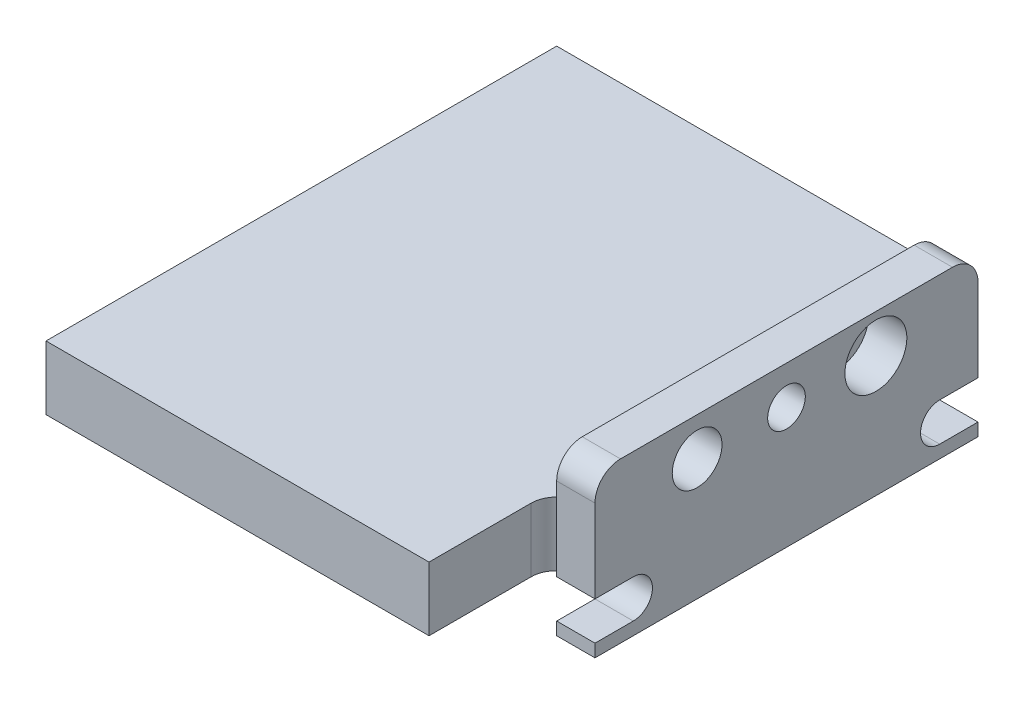
ISO-10303-21;
HEADER;
FILE_DESCRIPTION(('STEP AP214'),'2;1');
FILE_NAME('part.step','',(''),(''),'','','');
FILE_SCHEMA(('AUTOMOTIVE_DESIGN { 1 0 10303 214 1 1 1 1 }'));
ENDSEC;
DATA;
#1=APPLICATION_CONTEXT('core data for automotive mechanical design processes');
#2=APPLICATION_PROTOCOL_DEFINITION('international standard','automotive_design',2000,#1);
#3=PRODUCT_CONTEXT('',#1,'mechanical');
#4=PRODUCT('Part','Part','',(#3));
#5=PRODUCT_RELATED_PRODUCT_CATEGORY('part','',(#4));
#6=PRODUCT_DEFINITION_FORMATION('','',#4);
#7=PRODUCT_DEFINITION_CONTEXT('part definition',#1,'design');
#8=PRODUCT_DEFINITION('design','',#6,#7);
#9=PRODUCT_DEFINITION_SHAPE('','',#8);
#10=(LENGTH_UNIT() NAMED_UNIT(*) SI_UNIT(.MILLI.,.METRE.));
#11=(NAMED_UNIT(*) PLANE_ANGLE_UNIT() SI_UNIT($,.RADIAN.));
#12=(NAMED_UNIT(*) SI_UNIT($,.STERADIAN.) SOLID_ANGLE_UNIT());
#13=UNCERTAINTY_MEASURE_WITH_UNIT(LENGTH_MEASURE(1.E-05),#10,'distance_accuracy_value','');
#14=(GEOMETRIC_REPRESENTATION_CONTEXT(3) GLOBAL_UNCERTAINTY_ASSIGNED_CONTEXT((#13)) GLOBAL_UNIT_ASSIGNED_CONTEXT((#10,
#11,#12)) REPRESENTATION_CONTEXT('',''));
#15=CARTESIAN_POINT('',(0.,0.,0.));
#16=DIRECTION('',(0.,0.,1.));
#17=DIRECTION('',(1.,0.,0.));
#18=AXIS2_PLACEMENT_3D('',#15,#16,#17);
#19=CARTESIAN_POINT('',(3.,0.,0.));
#20=DIRECTION('',(1.,0.,0.));
#21=DIRECTION('',(0.,0.,-1.));
#22=AXIS2_PLACEMENT_3D('',#19,#20,#21);
#23=PLANE('',#22);
#24=DIRECTION('',(0.,0.,-1.));
#25=VECTOR('',#24,1.);
#26=CARTESIAN_POINT('',(3.,-2.5,15.));
#27=LINE('',#26,#25);
#28=CARTESIAN_POINT('',(3.,-2.5,15.));
#29=VERTEX_POINT('',#28);
#30=CARTESIAN_POINT('',(3.,-2.5,-15.));
#31=VERTEX_POINT('',#30);
#32=EDGE_CURVE('E202',#29,#31,#27,.T.);
#33=ORIENTED_EDGE('',*,*,#32,.T.);
#34=DIRECTION('',(0.,1.,0.));
#35=VECTOR('',#34,1.);
#36=CARTESIAN_POINT('',(3.,10.,-15.));
#37=LINE('',#36,#35);
#38=CARTESIAN_POINT('',(3.,-1.5,-15.));
#39=VERTEX_POINT('',#38);
#40=EDGE_CURVE('E335',#31,#39,#37,.T.);
#41=ORIENTED_EDGE('',*,*,#40,.T.);
#42=DIRECTION('',(0.,0.,-1.));
#43=VECTOR('',#42,1.);
#44=CARTESIAN_POINT('',(3.,-1.5,-12.));
#45=LINE('',#44,#43);
#46=CARTESIAN_POINT('',(3.,-1.5,-12.));
#47=VERTEX_POINT('',#46);
#48=EDGE_CURVE('E367',#47,#39,#45,.T.);
#49=ORIENTED_EDGE('',*,*,#48,.F.);
#50=CARTESIAN_POINT('',(3.,0.,-12.));
#51=DIRECTION('',(1.,0.,0.));
#52=DIRECTION('',(0.,0.,1.));
#53=AXIS2_PLACEMENT_3D('',#50,#51,#52);
#54=CIRCLE('',#53,1.5);
#55=CARTESIAN_POINT('',(3.,1.5,-12.));
#56=VERTEX_POINT('',#55);
#57=EDGE_CURVE('E364',#56,#47,#54,.T.);
#58=ORIENTED_EDGE('',*,*,#57,.F.);
#59=DIRECTION('',(0.,0.,1.));
#60=VECTOR('',#59,1.);
#61=CARTESIAN_POINT('',(3.,1.5,-12.));
#62=LINE('',#61,#60);
#63=CARTESIAN_POINT('',(3.,1.5,-15.));
#64=VERTEX_POINT('',#63);
#65=EDGE_CURVE('E362',#64,#56,#62,.T.);
#66=ORIENTED_EDGE('',*,*,#65,.F.);
#67=CARTESIAN_POINT('',(3.,8.,-15.));
#68=VERTEX_POINT('',#67);
#69=EDGE_CURVE('E228',#64,#68,#37,.T.);
#70=ORIENTED_EDGE('',*,*,#69,.T.);
#71=CARTESIAN_POINT('',(3.,8.,-13.));
#72=DIRECTION('',(1.,0.,0.));
#73=DIRECTION('',(0.,0.,-1.));
#74=AXIS2_PLACEMENT_3D('',#71,#72,#73);
#75=CIRCLE('',#74,2.);
#76=CARTESIAN_POINT('',(3.,10.,-13.));
#77=VERTEX_POINT('',#76);
#78=EDGE_CURVE('E263',#68,#77,#75,.T.);
#79=ORIENTED_EDGE('',*,*,#78,.T.);
#80=DIRECTION('',(0.,0.,1.));
#81=VECTOR('',#80,1.);
#82=CARTESIAN_POINT('',(3.,10.,15.));
#83=LINE('',#82,#81);
#84=CARTESIAN_POINT('',(3.,10.,13.));
#85=VERTEX_POINT('',#84);
#86=EDGE_CURVE('E337',#77,#85,#83,.T.);
#87=ORIENTED_EDGE('',*,*,#86,.T.);
#88=CARTESIAN_POINT('',(3.,8.,13.));
#89=DIRECTION('',(1.,0.,0.));
#90=DIRECTION('',(0.,0.,-1.));
#91=AXIS2_PLACEMENT_3D('',#88,#89,#90);
#92=CIRCLE('',#91,2.);
#93=CARTESIAN_POINT('',(3.,8.,15.));
#94=VERTEX_POINT('',#93);
#95=EDGE_CURVE('E271',#85,#94,#92,.T.);
#96=ORIENTED_EDGE('',*,*,#95,.T.);
#97=DIRECTION('',(0.,-1.,0.));
#98=VECTOR('',#97,1.);
#99=CARTESIAN_POINT('',(3.,10.,15.));
#100=LINE('',#99,#98);
#101=CARTESIAN_POINT('',(3.,1.5,15.));
#102=VERTEX_POINT('',#101);
#103=EDGE_CURVE('E243',#94,#102,#100,.T.);
#104=ORIENTED_EDGE('',*,*,#103,.T.);
#105=DIRECTION('',(0.,0.,1.));
#106=VECTOR('',#105,1.);
#107=CARTESIAN_POINT('',(3.,1.5,12.));
#108=LINE('',#107,#106);
#109=CARTESIAN_POINT('',(3.,1.5,12.));
#110=VERTEX_POINT('',#109);
#111=EDGE_CURVE('E394',#110,#102,#108,.T.);
#112=ORIENTED_EDGE('',*,*,#111,.F.);
#113=CARTESIAN_POINT('',(3.,0.,12.));
#114=DIRECTION('',(1.,0.,0.));
#115=DIRECTION('',(0.,0.,-1.));
#116=AXIS2_PLACEMENT_3D('',#113,#114,#115);
#117=CIRCLE('',#116,1.5);
#118=CARTESIAN_POINT('',(3.,-1.5,12.));
#119=VERTEX_POINT('',#118);
#120=EDGE_CURVE('E391',#119,#110,#117,.T.);
#121=ORIENTED_EDGE('',*,*,#120,.F.);
#122=DIRECTION('',(0.,0.,-1.));
#123=VECTOR('',#122,1.);
#124=CARTESIAN_POINT('',(3.,-1.5,12.));
#125=LINE('',#124,#123);
#126=CARTESIAN_POINT('',(3.,-1.5,15.));
#127=VERTEX_POINT('',#126);
#128=EDGE_CURVE('E389',#127,#119,#125,.T.);
#129=ORIENTED_EDGE('',*,*,#128,.F.);
#130=EDGE_CURVE('E340',#127,#29,#100,.T.);
#131=ORIENTED_EDGE('',*,*,#130,.T.);
#132=EDGE_LOOP('',(#33,#41,#49,#58,#66,#70,#79,#87,#96,#104,#112,#121,#129,#131));
#133=FACE_BOUND('',#132,.T.);
#134=CARTESIAN_POINT('',(3.,7.,-7.));
#135=DIRECTION('',(1.,0.,0.));
#136=DIRECTION('',(0.,0.,1.));
#137=AXIS2_PLACEMENT_3D('',#134,#135,#136);
#138=CIRCLE('',#137,2.425);
#139=CARTESIAN_POINT('',(3.,7.,-4.575));
#140=VERTEX_POINT('',#139);
#141=EDGE_CURVE('E378',#140,#140,#138,.T.);
#142=ORIENTED_EDGE('',*,*,#141,.F.);
#143=EDGE_LOOP('',(#142));
#144=FACE_BOUND('',#143,.T.);
#145=CARTESIAN_POINT('',(3.,7.,0.));
#146=DIRECTION('',(1.,0.,0.));
#147=DIRECTION('',(0.,0.,1.));
#148=AXIS2_PLACEMENT_3D('',#145,#146,#147);
#149=CIRCLE('',#148,1.475);
#150=CARTESIAN_POINT('',(3.,7.,1.475));
#151=VERTEX_POINT('',#150);
#152=EDGE_CURVE('E503',#151,#151,#149,.T.);
#153=ORIENTED_EDGE('',*,*,#152,.F.);
#154=EDGE_LOOP('',(#153));
#155=FACE_BOUND('',#154,.T.);
#156=CARTESIAN_POINT('',(3.,7.,7.));
#157=DIRECTION('',(1.,0.,0.));
#158=DIRECTION('',(0.,0.,1.));
#159=AXIS2_PLACEMENT_3D('',#156,#157,#158);
#160=CIRCLE('',#159,1.95);
#161=CARTESIAN_POINT('',(3.,7.,8.95));
#162=VERTEX_POINT('',#161);
#163=EDGE_CURVE('E509',#162,#162,#160,.T.);
#164=ORIENTED_EDGE('',*,*,#163,.F.);
#165=EDGE_LOOP('',(#164));
#166=FACE_BOUND('',#165,.T.);
#167=ADVANCED_FACE('F35',(#133,#144,#155,#166),#23,.T.);
#168=CARTESIAN_POINT('',(0.,0.,0.));
#169=DIRECTION('',(1.,0.,0.));
#170=DIRECTION('',(0.,0.,-1.));
#171=AXIS2_PLACEMENT_3D('',#168,#169,#170);
#172=PLANE('',#171);
#173=CARTESIAN_POINT('',(0.,7.,-7.));
#174=DIRECTION('',(1.,0.,0.));
#175=DIRECTION('',(0.,0.,1.));
#176=AXIS2_PLACEMENT_3D('',#173,#174,#175);
#177=CIRCLE('',#176,2.425);
#178=CARTESIAN_POINT('',(0.,7.,-4.575));
#179=VERTEX_POINT('',#178);
#180=EDGE_CURVE('E500',#179,#179,#177,.T.);
#181=ORIENTED_EDGE('',*,*,#180,.T.);
#182=EDGE_LOOP('',(#181));
#183=FACE_BOUND('',#182,.T.);
#184=CARTESIAN_POINT('',(0.,7.,0.));
#185=DIRECTION('',(1.,0.,0.));
#186=DIRECTION('',(0.,0.,1.));
#187=AXIS2_PLACEMENT_3D('',#184,#185,#186);
#188=CIRCLE('',#187,1.475);
#189=CARTESIAN_POINT('',(0.,7.,1.475));
#190=VERTEX_POINT('',#189);
#191=EDGE_CURVE('E506',#190,#190,#188,.T.);
#192=ORIENTED_EDGE('',*,*,#191,.T.);
#193=EDGE_LOOP('',(#192));
#194=FACE_BOUND('',#193,.T.);
#195=CARTESIAN_POINT('',(0.,7.,7.));
#196=DIRECTION('',(1.,0.,0.));
#197=DIRECTION('',(0.,0.,1.));
#198=AXIS2_PLACEMENT_3D('',#195,#196,#197);
#199=CIRCLE('',#198,1.95);
#200=CARTESIAN_POINT('',(0.,7.,8.95));
#201=VERTEX_POINT('',#200);
#202=EDGE_CURVE('E512',#201,#201,#199,.T.);
#203=ORIENTED_EDGE('',*,*,#202,.T.);
#204=EDGE_LOOP('',(#203));
#205=FACE_BOUND('',#204,.T.);
#206=DIRECTION('',(0.,1.,0.));
#207=VECTOR('',#206,1.);
#208=CARTESIAN_POINT('',(0.,10.,-15.));
#209=LINE('',#208,#207);
#210=CARTESIAN_POINT('',(0.,-2.5,-15.));
#211=VERTEX_POINT('',#210);
#212=CARTESIAN_POINT('',(0.,-1.5,-15.));
#213=VERTEX_POINT('',#212);
#214=EDGE_CURVE('E230',#211,#213,#209,.T.);
#215=ORIENTED_EDGE('',*,*,#214,.F.);
#216=DIRECTION('',(0.,0.,-1.));
#217=VECTOR('',#216,1.);
#218=CARTESIAN_POINT('',(0.,-2.5,15.));
#219=LINE('',#218,#217);
#220=CARTESIAN_POINT('',(0.,-2.5,-10.));
#221=VERTEX_POINT('',#220);
#222=EDGE_CURVE('E207',#221,#211,#219,.T.);
#223=ORIENTED_EDGE('',*,*,#222,.F.);
#224=DIRECTION('',(0.,1.,0.));
#225=VECTOR('',#224,1.);
#226=CARTESIAN_POINT('',(0.,2.5,-10.));
#227=LINE('',#226,#225);
#228=CARTESIAN_POINT('',(0.,2.5,-10.));
#229=VERTEX_POINT('',#228);
#230=EDGE_CURVE('E239',#221,#229,#227,.T.);
#231=ORIENTED_EDGE('',*,*,#230,.T.);
#232=DIRECTION('',(0.,0.,1.));
#233=VECTOR('',#232,1.);
#234=CARTESIAN_POINT('',(0.,2.5,10.));
#235=LINE('',#234,#233);
#236=CARTESIAN_POINT('',(0.,2.5,10.));
#237=VERTEX_POINT('',#236);
#238=EDGE_CURVE('E242',#229,#237,#235,.T.);
#239=ORIENTED_EDGE('',*,*,#238,.T.);
#240=DIRECTION('',(0.,-1.,0.));
#241=VECTOR('',#240,1.);
#242=CARTESIAN_POINT('',(0.,2.5,10.));
#243=LINE('',#242,#241);
#244=CARTESIAN_POINT('',(0.,-2.5,10.));
#245=VERTEX_POINT('',#244);
#246=EDGE_CURVE('E219',#237,#245,#243,.T.);
#247=ORIENTED_EDGE('',*,*,#246,.T.);
#248=CARTESIAN_POINT('',(0.,-2.5,15.));
#249=VERTEX_POINT('',#248);
#250=EDGE_CURVE('E199',#249,#245,#219,.T.);
#251=ORIENTED_EDGE('',*,*,#250,.F.);
#252=DIRECTION('',(0.,-1.,0.));
#253=VECTOR('',#252,1.);
#254=CARTESIAN_POINT('',(0.,10.,15.));
#255=LINE('',#254,#253);
#256=CARTESIAN_POINT('',(0.,-1.5,15.));
#257=VERTEX_POINT('',#256);
#258=EDGE_CURVE('E216',#257,#249,#255,.T.);
#259=ORIENTED_EDGE('',*,*,#258,.F.);
#260=DIRECTION('',(0.,0.,-1.));
#261=VECTOR('',#260,1.);
#262=CARTESIAN_POINT('',(0.,-1.5,12.));
#263=LINE('',#262,#261);
#264=CARTESIAN_POINT('',(0.,-1.5,12.));
#265=VERTEX_POINT('',#264);
#266=EDGE_CURVE('E388',#257,#265,#263,.T.);
#267=ORIENTED_EDGE('',*,*,#266,.T.);
#268=CARTESIAN_POINT('',(0.,0.,12.));
#269=DIRECTION('',(1.,0.,0.));
#270=DIRECTION('',(0.,0.,-1.));
#271=AXIS2_PLACEMENT_3D('',#268,#269,#270);
#272=CIRCLE('',#271,1.5);
#273=CARTESIAN_POINT('',(0.,1.5,12.));
#274=VERTEX_POINT('',#273);
#275=EDGE_CURVE('E397',#265,#274,#272,.T.);
#276=ORIENTED_EDGE('',*,*,#275,.T.);
#277=DIRECTION('',(0.,0.,1.));
#278=VECTOR('',#277,1.);
#279=CARTESIAN_POINT('',(0.,1.5,12.));
#280=LINE('',#279,#278);
#281=CARTESIAN_POINT('',(0.,1.5,15.));
#282=VERTEX_POINT('',#281);
#283=EDGE_CURVE('E392',#274,#282,#280,.T.);
#284=ORIENTED_EDGE('',*,*,#283,.T.);
#285=CARTESIAN_POINT('',(0.,8.,15.));
#286=VERTEX_POINT('',#285);
#287=EDGE_CURVE('E224',#286,#282,#255,.T.);
#288=ORIENTED_EDGE('',*,*,#287,.F.);
#289=CARTESIAN_POINT('',(0.,8.,13.));
#290=DIRECTION('',(1.,0.,0.));
#291=DIRECTION('',(0.,0.,-1.));
#292=AXIS2_PLACEMENT_3D('',#289,#290,#291);
#293=CIRCLE('',#292,2.);
#294=CARTESIAN_POINT('',(0.,10.,13.));
#295=VERTEX_POINT('',#294);
#296=EDGE_CURVE('E273',#286,#295,#293,.F.);
#297=ORIENTED_EDGE('',*,*,#296,.T.);
#298=DIRECTION('',(0.,0.,1.));
#299=VECTOR('',#298,1.);
#300=CARTESIAN_POINT('',(0.,10.,15.));
#301=LINE('',#300,#299);
#302=CARTESIAN_POINT('',(0.,10.,-13.));
#303=VERTEX_POINT('',#302);
#304=EDGE_CURVE('E225',#303,#295,#301,.T.);
#305=ORIENTED_EDGE('',*,*,#304,.F.);
#306=CARTESIAN_POINT('',(0.,8.,-13.));
#307=DIRECTION('',(1.,0.,0.));
#308=DIRECTION('',(0.,0.,-1.));
#309=AXIS2_PLACEMENT_3D('',#306,#307,#308);
#310=CIRCLE('',#309,2.);
#311=CARTESIAN_POINT('',(0.,8.,-15.));
#312=VERTEX_POINT('',#311);
#313=EDGE_CURVE('E260',#303,#312,#310,.F.);
#314=ORIENTED_EDGE('',*,*,#313,.T.);
#315=CARTESIAN_POINT('',(0.,1.5,-15.));
#316=VERTEX_POINT('',#315);
#317=EDGE_CURVE('E334',#316,#312,#209,.T.);
#318=ORIENTED_EDGE('',*,*,#317,.F.);
#319=DIRECTION('',(0.,0.,1.));
#320=VECTOR('',#319,1.);
#321=CARTESIAN_POINT('',(0.,1.5,-12.));
#322=LINE('',#321,#320);
#323=CARTESIAN_POINT('',(0.,1.5,-12.));
#324=VERTEX_POINT('',#323);
#325=EDGE_CURVE('E50',#316,#324,#322,.T.);
#326=ORIENTED_EDGE('',*,*,#325,.T.);
#327=CARTESIAN_POINT('',(0.,0.,-12.));
#328=DIRECTION('',(1.,0.,0.));
#329=DIRECTION('',(0.,0.,1.));
#330=AXIS2_PLACEMENT_3D('',#327,#328,#329);
#331=CIRCLE('',#330,1.5);
#332=CARTESIAN_POINT('',(0.,-1.5,-12.));
#333=VERTEX_POINT('',#332);
#334=EDGE_CURVE('E374',#324,#333,#331,.T.);
#335=ORIENTED_EDGE('',*,*,#334,.T.);
#336=DIRECTION('',(0.,0.,-1.));
#337=VECTOR('',#336,1.);
#338=CARTESIAN_POINT('',(0.,-1.5,-12.));
#339=LINE('',#338,#337);
#340=EDGE_CURVE('E377',#333,#213,#339,.T.);
#341=ORIENTED_EDGE('',*,*,#340,.T.);
#342=EDGE_LOOP('',(#215,#223,#231,#239,#247,#251,#259,#267,#276,#284,#288,#297,#305,#314,#318,
#326,#335,#341));
#343=FACE_BOUND('',#342,.T.);
#344=ADVANCED_FACE('F214',(#183,#194,#205,#343),#172,.F.);
#345=CARTESIAN_POINT('',(3.,10.,-15.));
#346=DIRECTION('',(0.,0.,1.));
#347=DIRECTION('',(1.,0.,0.));
#348=AXIS2_PLACEMENT_3D('',#345,#346,#347);
#349=PLANE('',#348);
#350=ORIENTED_EDGE('',*,*,#40,.F.);
#351=DIRECTION('',(1.,0.,0.));
#352=VECTOR('',#351,1.);
#353=CARTESIAN_POINT('',(0.,-2.5,-15.));
#354=LINE('',#353,#352);
#355=EDGE_CURVE('E208',#211,#31,#354,.T.);
#356=ORIENTED_EDGE('',*,*,#355,.F.);
#357=ORIENTED_EDGE('',*,*,#214,.T.);
#358=DIRECTION('',(-1.,0.,0.));
#359=VECTOR('',#358,1.);
#360=CARTESIAN_POINT('',(3.,-1.5,-15.));
#361=LINE('',#360,#359);
#362=EDGE_CURVE('E383',#39,#213,#361,.T.);
#363=ORIENTED_EDGE('',*,*,#362,.F.);
#364=EDGE_LOOP('',(#350,#356,#357,#363));
#365=FACE_BOUND('',#364,.T.);
#366=ADVANCED_FACE('F443',(#365),#349,.F.);
#367=DIRECTION('',(-1.,0.,0.));
#368=VECTOR('',#367,1.);
#369=CARTESIAN_POINT('',(3.,1.5,-15.));
#370=LINE('',#369,#368);
#371=EDGE_CURVE('E351',#64,#316,#370,.T.);
#372=ORIENTED_EDGE('',*,*,#371,.T.);
#373=ORIENTED_EDGE('',*,*,#317,.T.);
#374=DIRECTION('',(1.,0.,0.));
#375=VECTOR('',#374,1.);
#376=CARTESIAN_POINT('',(3.,8.,-15.));
#377=LINE('',#376,#375);
#378=EDGE_CURVE('E249',#312,#68,#377,.T.);
#379=ORIENTED_EDGE('',*,*,#378,.T.);
#380=ORIENTED_EDGE('',*,*,#69,.F.);
#381=EDGE_LOOP('',(#372,#373,#379,#380));
#382=FACE_BOUND('',#381,.T.);
#383=ADVANCED_FACE('F348',(#382),#349,.F.);
#384=CARTESIAN_POINT('',(3.,10.,15.));
#385=DIRECTION('',(0.,0.,-1.));
#386=DIRECTION('',(0.,1.,0.));
#387=AXIS2_PLACEMENT_3D('',#384,#385,#386);
#388=PLANE('',#387);
#389=ORIENTED_EDGE('',*,*,#258,.T.);
#390=DIRECTION('',(1.,0.,0.));
#391=VECTOR('',#390,1.);
#392=CARTESIAN_POINT('',(0.,-2.5,15.));
#393=LINE('',#392,#391);
#394=EDGE_CURVE('E195',#249,#29,#393,.T.);
#395=ORIENTED_EDGE('',*,*,#394,.T.);
#396=ORIENTED_EDGE('',*,*,#130,.F.);
#397=DIRECTION('',(-1.,0.,0.));
#398=VECTOR('',#397,1.);
#399=CARTESIAN_POINT('',(3.,-1.5,15.));
#400=LINE('',#399,#398);
#401=EDGE_CURVE('E223',#127,#257,#400,.T.);
#402=ORIENTED_EDGE('',*,*,#401,.T.);
#403=EDGE_LOOP('',(#389,#395,#396,#402));
#404=FACE_BOUND('',#403,.T.);
#405=ADVANCED_FACE('F222',(#404),#388,.F.);
#406=DIRECTION('',(-1.,0.,0.));
#407=VECTOR('',#406,1.);
#408=CARTESIAN_POINT('',(3.,1.5,15.));
#409=LINE('',#408,#407);
#410=EDGE_CURVE('E58',#102,#282,#409,.T.);
#411=ORIENTED_EDGE('',*,*,#410,.F.);
#412=ORIENTED_EDGE('',*,*,#103,.F.);
#413=DIRECTION('',(-1.,0.,0.));
#414=VECTOR('',#413,1.);
#415=CARTESIAN_POINT('',(3.,8.,15.));
#416=LINE('',#415,#414);
#417=EDGE_CURVE('E265',#94,#286,#416,.T.);
#418=ORIENTED_EDGE('',*,*,#417,.T.);
#419=ORIENTED_EDGE('',*,*,#287,.T.);
#420=EDGE_LOOP('',(#411,#412,#418,#419));
#421=FACE_BOUND('',#420,.T.);
#422=ADVANCED_FACE('F416',(#421),#388,.F.);
#423=CARTESIAN_POINT('',(-3.,2.5,12.));
#424=DIRECTION('',(0.,-1.,0.));
#425=DIRECTION('',(0.,0.,-1.));
#426=AXIS2_PLACEMENT_3D('',#423,#424,#425);
#427=CYLINDRICAL_SURFACE('',#426,2.);
#428=DIRECTION('',(0.,-1.,0.));
#429=VECTOR('',#428,1.);
#430=CARTESIAN_POINT('',(-3.,2.5,10.));
#431=LINE('',#430,#429);
#432=CARTESIAN_POINT('',(-3.,2.5,10.));
#433=VERTEX_POINT('',#432);
#434=CARTESIAN_POINT('',(-3.,-2.5,10.));
#435=VERTEX_POINT('',#434);
#436=EDGE_CURVE('E285',#433,#435,#431,.T.);
#437=ORIENTED_EDGE('',*,*,#436,.F.);
#438=CARTESIAN_POINT('',(-3.,2.5,12.));
#439=DIRECTION('',(0.,1.,0.));
#440=DIRECTION('',(0.,0.,1.));
#441=AXIS2_PLACEMENT_3D('',#438,#439,#440);
#442=CIRCLE('',#441,2.);
#443=CARTESIAN_POINT('',(-5.,2.5,12.));
#444=VERTEX_POINT('',#443);
#445=EDGE_CURVE('E43',#433,#444,#442,.T.);
#446=ORIENTED_EDGE('',*,*,#445,.T.);
#447=DIRECTION('',(0.,-1.,0.));
#448=VECTOR('',#447,1.);
#449=CARTESIAN_POINT('',(-5.,2.5,12.));
#450=LINE('',#449,#448);
#451=CARTESIAN_POINT('',(-5.,-2.5,12.));
#452=VERTEX_POINT('',#451);
#453=EDGE_CURVE('E288',#452,#444,#450,.F.);
#454=ORIENTED_EDGE('',*,*,#453,.F.);
#455=CARTESIAN_POINT('',(-3.,-2.5,12.));
#456=DIRECTION('',(0.,-1.,0.));
#457=DIRECTION('',(0.,0.,-1.));
#458=AXIS2_PLACEMENT_3D('',#455,#456,#457);
#459=CIRCLE('',#458,2.);
#460=EDGE_CURVE('E11',#452,#435,#459,.T.);
#461=ORIENTED_EDGE('',*,*,#460,.T.);
#462=EDGE_LOOP('',(#437,#446,#454,#461));
#463=FACE_BOUND('',#462,.T.);
#464=ADVANCED_FACE('F37',(#463),#427,.F.);
#465=CARTESIAN_POINT('',(-3.,2.5,-12.));
#466=DIRECTION('',(0.,-1.,0.));
#467=DIRECTION('',(0.,0.,-1.));
#468=AXIS2_PLACEMENT_3D('',#465,#466,#467);
#469=CYLINDRICAL_SURFACE('',#468,2.);
#470=DIRECTION('',(0.,-1.,0.));
#471=VECTOR('',#470,1.);
#472=CARTESIAN_POINT('',(-5.,2.5,-12.));
#473=LINE('',#472,#471);
#474=CARTESIAN_POINT('',(-5.,2.5,-12.));
#475=VERTEX_POINT('',#474);
#476=CARTESIAN_POINT('',(-5.,-2.5,-12.));
#477=VERTEX_POINT('',#476);
#478=EDGE_CURVE('E275',#475,#477,#473,.T.);
#479=ORIENTED_EDGE('',*,*,#478,.F.);
#480=CARTESIAN_POINT('',(-3.,2.5,-12.));
#481=DIRECTION('',(0.,1.,0.));
#482=DIRECTION('',(0.,0.,1.));
#483=AXIS2_PLACEMENT_3D('',#480,#481,#482);
#484=CIRCLE('',#483,2.);
#485=CARTESIAN_POINT('',(-3.,2.5,-10.));
#486=VERTEX_POINT('',#485);
#487=EDGE_CURVE('E281',#475,#486,#484,.T.);
#488=ORIENTED_EDGE('',*,*,#487,.T.);
#489=DIRECTION('',(0.,-1.,0.));
#490=VECTOR('',#489,1.);
#491=CARTESIAN_POINT('',(-3.,2.5,-10.));
#492=LINE('',#491,#490);
#493=CARTESIAN_POINT('',(-3.,-2.5,-10.));
#494=VERTEX_POINT('',#493);
#495=EDGE_CURVE('E278',#494,#486,#492,.F.);
#496=ORIENTED_EDGE('',*,*,#495,.F.);
#497=CARTESIAN_POINT('',(-3.,-2.5,-12.));
#498=DIRECTION('',(0.,-1.,0.));
#499=DIRECTION('',(0.,0.,-1.));
#500=AXIS2_PLACEMENT_3D('',#497,#498,#499);
#501=CIRCLE('',#500,2.);
#502=EDGE_CURVE('E283',#494,#477,#501,.T.);
#503=ORIENTED_EDGE('',*,*,#502,.T.);
#504=EDGE_LOOP('',(#479,#488,#496,#503));
#505=FACE_BOUND('',#504,.T.);
#506=ADVANCED_FACE('F467',(#505),#469,.F.);
#507=CARTESIAN_POINT('',(-35.,2.5,-10.));
#508=DIRECTION('',(0.,0.,-1.));
#509=DIRECTION('',(-1.,0.,0.));
#510=AXIS2_PLACEMENT_3D('',#507,#508,#509);
#511=PLANE('',#510);
#512=DIRECTION('',(1.,0.,0.));
#513=VECTOR('',#512,1.);
#514=CARTESIAN_POINT('',(-35.,-2.5,-10.));
#515=LINE('',#514,#513);
#516=EDGE_CURVE('E246',#494,#221,#515,.T.);
#517=ORIENTED_EDGE('',*,*,#516,.F.);
#518=ORIENTED_EDGE('',*,*,#495,.T.);
#519=DIRECTION('',(1.,0.,0.));
#520=VECTOR('',#519,1.);
#521=CARTESIAN_POINT('',(-35.,2.5,-10.));
#522=LINE('',#521,#520);
#523=EDGE_CURVE('E238',#486,#229,#522,.T.);
#524=ORIENTED_EDGE('',*,*,#523,.T.);
#525=ORIENTED_EDGE('',*,*,#230,.F.);
#526=EDGE_LOOP('',(#517,#518,#524,#525));
#527=FACE_BOUND('',#526,.T.);
#528=ADVANCED_FACE('F461',(#527),#511,.T.);
#529=CARTESIAN_POINT('',(-35.,2.5,10.));
#530=DIRECTION('',(0.,0.,1.));
#531=DIRECTION('',(1.,0.,0.));
#532=AXIS2_PLACEMENT_3D('',#529,#530,#531);
#533=PLANE('',#532);
#534=DIRECTION('',(1.,0.,0.));
#535=VECTOR('',#534,1.);
#536=CARTESIAN_POINT('',(-35.,2.5,10.));
#537=LINE('',#536,#535);
#538=EDGE_CURVE('E252',#433,#237,#537,.T.);
#539=ORIENTED_EDGE('',*,*,#538,.F.);
#540=ORIENTED_EDGE('',*,*,#436,.T.);
#541=DIRECTION('',(1.,0.,0.));
#542=VECTOR('',#541,1.);
#543=CARTESIAN_POINT('',(-35.,-2.5,10.));
#544=LINE('',#543,#542);
#545=EDGE_CURVE('E250',#435,#245,#544,.T.);
#546=ORIENTED_EDGE('',*,*,#545,.T.);
#547=ORIENTED_EDGE('',*,*,#246,.F.);
#548=EDGE_LOOP('',(#539,#540,#546,#547));
#549=FACE_BOUND('',#548,.T.);
#550=ADVANCED_FACE('F458',(#549),#533,.T.);
#551=CARTESIAN_POINT('',(3.,8.,13.));
#552=DIRECTION('',(-1.,0.,0.));
#553=DIRECTION('',(0.,0.,1.));
#554=AXIS2_PLACEMENT_3D('',#551,#552,#553);
#555=CYLINDRICAL_SURFACE('',#554,2.);
#556=ORIENTED_EDGE('',*,*,#417,.F.);
#557=ORIENTED_EDGE('',*,*,#95,.F.);
#558=DIRECTION('',(-1.,0.,0.));
#559=VECTOR('',#558,1.);
#560=CARTESIAN_POINT('',(3.,10.,13.));
#561=LINE('',#560,#559);
#562=EDGE_CURVE('E268',#295,#85,#561,.F.);
#563=ORIENTED_EDGE('',*,*,#562,.F.);
#564=ORIENTED_EDGE('',*,*,#296,.F.);
#565=EDGE_LOOP('',(#556,#557,#563,#564));
#566=FACE_BOUND('',#565,.T.);
#567=ADVANCED_FACE('F420',(#566),#555,.T.);
#568=CARTESIAN_POINT('',(3.,8.,-13.));
#569=DIRECTION('',(1.,0.,0.));
#570=DIRECTION('',(0.,0.,-1.));
#571=AXIS2_PLACEMENT_3D('',#568,#569,#570);
#572=CYLINDRICAL_SURFACE('',#571,2.);
#573=ORIENTED_EDGE('',*,*,#378,.F.);
#574=ORIENTED_EDGE('',*,*,#313,.F.);
#575=DIRECTION('',(1.,0.,0.));
#576=VECTOR('',#575,1.);
#577=CARTESIAN_POINT('',(3.,10.,-13.));
#578=LINE('',#577,#576);
#579=EDGE_CURVE('E257',#77,#303,#578,.F.);
#580=ORIENTED_EDGE('',*,*,#579,.F.);
#581=ORIENTED_EDGE('',*,*,#78,.F.);
#582=EDGE_LOOP('',(#573,#574,#580,#581));
#583=FACE_BOUND('',#582,.T.);
#584=ADVANCED_FACE('F356',(#583),#572,.T.);
#585=CARTESIAN_POINT('',(-35.,-2.5,10.));
#586=DIRECTION('',(0.,-1.,0.));
#587=DIRECTION('',(0.,0.,-1.));
#588=AXIS2_PLACEMENT_3D('',#585,#586,#587);
#589=PLANE('',#588);
#590=ORIENTED_EDGE('',*,*,#502,.F.);
#591=ORIENTED_EDGE('',*,*,#516,.T.);
#592=ORIENTED_EDGE('',*,*,#222,.T.);
#593=ORIENTED_EDGE('',*,*,#355,.T.);
#594=ORIENTED_EDGE('',*,*,#32,.F.);
#595=ORIENTED_EDGE('',*,*,#394,.F.);
#596=ORIENTED_EDGE('',*,*,#250,.T.);
#597=ORIENTED_EDGE('',*,*,#545,.F.);
#598=ORIENTED_EDGE('',*,*,#460,.F.);
#599=DIRECTION('',(0.,0.,-1.));
#600=VECTOR('',#599,1.);
#601=CARTESIAN_POINT('',(-5.,-2.5,-20.));
#602=LINE('',#601,#600);
#603=CARTESIAN_POINT('',(-5.,-2.5,20.));
#604=VERTEX_POINT('',#603);
#605=EDGE_CURVE('E303',#604,#452,#602,.T.);
#606=ORIENTED_EDGE('',*,*,#605,.F.);
#607=DIRECTION('',(1.,0.,0.));
#608=VECTOR('',#607,1.);
#609=CARTESIAN_POINT('',(-35.,-2.5,20.));
#610=LINE('',#609,#608);
#611=CARTESIAN_POINT('',(-35.,-2.5,20.));
#612=VERTEX_POINT('',#611);
#613=EDGE_CURVE('E317',#612,#604,#610,.T.);
#614=ORIENTED_EDGE('',*,*,#613,.F.);
#615=DIRECTION('',(0.,0.,-1.));
#616=VECTOR('',#615,1.);
#617=CARTESIAN_POINT('',(-35.,-2.5,10.));
#618=LINE('',#617,#616);
#619=CARTESIAN_POINT('',(-35.,-2.5,-20.));
#620=VERTEX_POINT('',#619);
#621=EDGE_CURVE('E236',#612,#620,#618,.T.);
#622=ORIENTED_EDGE('',*,*,#621,.T.);
#623=DIRECTION('',(-1.,0.,0.));
#624=VECTOR('',#623,1.);
#625=CARTESIAN_POINT('',(-35.,-2.5,-20.));
#626=LINE('',#625,#624);
#627=CARTESIAN_POINT('',(-5.,-2.5,-20.));
#628=VERTEX_POINT('',#627);
#629=EDGE_CURVE('E321',#628,#620,#626,.T.);
#630=ORIENTED_EDGE('',*,*,#629,.F.);
#631=EDGE_CURVE('E319',#477,#628,#602,.T.);
#632=ORIENTED_EDGE('',*,*,#631,.F.);
#633=EDGE_LOOP('',(#590,#591,#592,#593,#594,#595,#596,#597,#598,#606,#614,#622,#630,#632));
#634=FACE_BOUND('',#633,.T.);
#635=ADVANCED_FACE('F197',(#634),#589,.T.);
#636=CARTESIAN_POINT('',(-35.,2.5,10.));
#637=DIRECTION('',(0.,1.,0.));
#638=DIRECTION('',(0.,0.,1.));
#639=AXIS2_PLACEMENT_3D('',#636,#637,#638);
#640=PLANE('',#639);
#641=ORIENTED_EDGE('',*,*,#445,.F.);
#642=ORIENTED_EDGE('',*,*,#538,.T.);
#643=ORIENTED_EDGE('',*,*,#238,.F.);
#644=ORIENTED_EDGE('',*,*,#523,.F.);
#645=ORIENTED_EDGE('',*,*,#487,.F.);
#646=DIRECTION('',(0.,0.,-1.));
#647=VECTOR('',#646,1.);
#648=CARTESIAN_POINT('',(-5.,2.5,-20.));
#649=LINE('',#648,#647);
#650=CARTESIAN_POINT('',(-5.,2.5,-20.));
#651=VERTEX_POINT('',#650);
#652=EDGE_CURVE('E309',#475,#651,#649,.T.);
#653=ORIENTED_EDGE('',*,*,#652,.T.);
#654=DIRECTION('',(-1.,0.,0.));
#655=VECTOR('',#654,1.);
#656=CARTESIAN_POINT('',(-35.,2.5,-20.));
#657=LINE('',#656,#655);
#658=CARTESIAN_POINT('',(-35.,2.5,-20.));
#659=VERTEX_POINT('',#658);
#660=EDGE_CURVE('E308',#651,#659,#657,.T.);
#661=ORIENTED_EDGE('',*,*,#660,.T.);
#662=DIRECTION('',(0.,0.,1.));
#663=VECTOR('',#662,1.);
#664=CARTESIAN_POINT('',(-35.,2.5,10.));
#665=LINE('',#664,#663);
#666=CARTESIAN_POINT('',(-35.,2.5,20.));
#667=VERTEX_POINT('',#666);
#668=EDGE_CURVE('E234',#659,#667,#665,.T.);
#669=ORIENTED_EDGE('',*,*,#668,.T.);
#670=DIRECTION('',(1.,0.,0.));
#671=VECTOR('',#670,1.);
#672=CARTESIAN_POINT('',(-35.,2.5,20.));
#673=LINE('',#672,#671);
#674=CARTESIAN_POINT('',(-5.,2.5,20.));
#675=VERTEX_POINT('',#674);
#676=EDGE_CURVE('E306',#667,#675,#673,.T.);
#677=ORIENTED_EDGE('',*,*,#676,.T.);
#678=EDGE_CURVE('E301',#675,#444,#649,.T.);
#679=ORIENTED_EDGE('',*,*,#678,.T.);
#680=EDGE_LOOP('',(#641,#642,#643,#644,#645,#653,#661,#669,#677,#679));
#681=FACE_BOUND('',#680,.T.);
#682=ADVANCED_FACE('F304',(#681),#640,.T.);
#683=CARTESIAN_POINT('',(-35.,0.,0.));
#684=DIRECTION('',(1.,0.,0.));
#685=DIRECTION('',(0.,0.,-1.));
#686=AXIS2_PLACEMENT_3D('',#683,#684,#685);
#687=PLANE('',#686);
#688=ORIENTED_EDGE('',*,*,#668,.F.);
#689=DIRECTION('',(0.,-1.,0.));
#690=VECTOR('',#689,1.);
#691=CARTESIAN_POINT('',(-35.,2.5,-20.));
#692=LINE('',#691,#690);
#693=EDGE_CURVE('E312',#659,#620,#692,.T.);
#694=ORIENTED_EDGE('',*,*,#693,.T.);
#695=ORIENTED_EDGE('',*,*,#621,.F.);
#696=DIRECTION('',(0.,-1.,0.));
#697=VECTOR('',#696,1.);
#698=CARTESIAN_POINT('',(-35.,2.5,20.));
#699=LINE('',#698,#697);
#700=EDGE_CURVE('E331',#667,#612,#699,.T.);
#701=ORIENTED_EDGE('',*,*,#700,.F.);
#702=EDGE_LOOP('',(#688,#694,#695,#701));
#703=FACE_BOUND('',#702,.T.);
#704=ADVANCED_FACE('F426',(#703),#687,.F.);
#705=CARTESIAN_POINT('',(3.,10.,15.));
#706=DIRECTION('',(0.,-1.,0.));
#707=DIRECTION('',(0.,0.,-1.));
#708=AXIS2_PLACEMENT_3D('',#705,#706,#707);
#709=PLANE('',#708);
#710=ORIENTED_EDGE('',*,*,#304,.T.);
#711=ORIENTED_EDGE('',*,*,#562,.T.);
#712=ORIENTED_EDGE('',*,*,#86,.F.);
#713=ORIENTED_EDGE('',*,*,#579,.T.);
#714=EDGE_LOOP('',(#710,#711,#712,#713));
#715=FACE_BOUND('',#714,.T.);
#716=ADVANCED_FACE('F423',(#715),#709,.F.);
#717=CARTESIAN_POINT('',(-35.,2.5,20.));
#718=DIRECTION('',(0.,0.,-1.));
#719=DIRECTION('',(-1.,0.,0.));
#720=AXIS2_PLACEMENT_3D('',#717,#718,#719);
#721=PLANE('',#720);
#722=ORIENTED_EDGE('',*,*,#613,.T.);
#723=DIRECTION('',(0.,-1.,0.));
#724=VECTOR('',#723,1.);
#725=CARTESIAN_POINT('',(-5.,2.5,20.));
#726=LINE('',#725,#724);
#727=EDGE_CURVE('E329',#675,#604,#726,.T.);
#728=ORIENTED_EDGE('',*,*,#727,.F.);
#729=ORIENTED_EDGE('',*,*,#676,.F.);
#730=ORIENTED_EDGE('',*,*,#700,.T.);
#731=EDGE_LOOP('',(#722,#728,#729,#730));
#732=FACE_BOUND('',#731,.T.);
#733=ADVANCED_FACE('F425',(#732),#721,.F.);
#734=CARTESIAN_POINT('',(-5.,2.5,-20.));
#735=DIRECTION('',(-1.,0.,0.));
#736=DIRECTION('',(0.,0.,1.));
#737=AXIS2_PLACEMENT_3D('',#734,#735,#736);
#738=PLANE('',#737);
#739=ORIENTED_EDGE('',*,*,#605,.T.);
#740=ORIENTED_EDGE('',*,*,#453,.T.);
#741=ORIENTED_EDGE('',*,*,#678,.F.);
#742=ORIENTED_EDGE('',*,*,#727,.T.);
#743=EDGE_LOOP('',(#739,#740,#741,#742));
#744=FACE_BOUND('',#743,.T.);
#745=ADVANCED_FACE('F299',(#744),#738,.F.);
#746=ORIENTED_EDGE('',*,*,#652,.F.);
#747=ORIENTED_EDGE('',*,*,#478,.T.);
#748=ORIENTED_EDGE('',*,*,#631,.T.);
#749=DIRECTION('',(0.,-1.,0.));
#750=VECTOR('',#749,1.);
#751=CARTESIAN_POINT('',(-5.,2.5,-20.));
#752=LINE('',#751,#750);
#753=EDGE_CURVE('E326',#651,#628,#752,.T.);
#754=ORIENTED_EDGE('',*,*,#753,.F.);
#755=EDGE_LOOP('',(#746,#747,#748,#754));
#756=FACE_BOUND('',#755,.T.);
#757=ADVANCED_FACE('F483',(#756),#738,.F.);
#758=CARTESIAN_POINT('',(-35.,2.5,-20.));
#759=DIRECTION('',(0.,0.,1.));
#760=DIRECTION('',(1.,0.,0.));
#761=AXIS2_PLACEMENT_3D('',#758,#759,#760);
#762=PLANE('',#761);
#763=ORIENTED_EDGE('',*,*,#629,.T.);
#764=ORIENTED_EDGE('',*,*,#693,.F.);
#765=ORIENTED_EDGE('',*,*,#660,.F.);
#766=ORIENTED_EDGE('',*,*,#753,.T.);
#767=EDGE_LOOP('',(#763,#764,#765,#766));
#768=FACE_BOUND('',#767,.T.);
#769=ADVANCED_FACE('F492',(#768),#762,.F.);
#770=CARTESIAN_POINT('',(3.,-1.5,12.));
#771=DIRECTION('',(0.,1.,0.));
#772=DIRECTION('',(0.,0.,1.));
#773=AXIS2_PLACEMENT_3D('',#770,#771,#772);
#774=PLANE('',#773);
#775=ORIENTED_EDGE('',*,*,#266,.F.);
#776=ORIENTED_EDGE('',*,*,#401,.F.);
#777=ORIENTED_EDGE('',*,*,#128,.T.);
#778=DIRECTION('',(-1.,0.,0.));
#779=VECTOR('',#778,1.);
#780=CARTESIAN_POINT('',(3.,-1.5,12.));
#781=LINE('',#780,#779);
#782=EDGE_CURVE('E404',#119,#265,#781,.T.);
#783=ORIENTED_EDGE('',*,*,#782,.T.);
#784=EDGE_LOOP('',(#775,#776,#777,#783));
#785=FACE_BOUND('',#784,.T.);
#786=ADVANCED_FACE('F408',(#785),#774,.T.);
#787=CARTESIAN_POINT('',(3.,0.,12.));
#788=DIRECTION('',(-1.,0.,0.));
#789=DIRECTION('',(0.,0.,1.));
#790=AXIS2_PLACEMENT_3D('',#787,#788,#789);
#791=CYLINDRICAL_SURFACE('',#790,1.5);
#792=ORIENTED_EDGE('',*,*,#275,.F.);
#793=ORIENTED_EDGE('',*,*,#782,.F.);
#794=ORIENTED_EDGE('',*,*,#120,.T.);
#795=DIRECTION('',(-1.,0.,0.));
#796=VECTOR('',#795,1.);
#797=CARTESIAN_POINT('',(3.,1.5,12.));
#798=LINE('',#797,#796);
#799=EDGE_CURVE('E402',#110,#274,#798,.T.);
#800=ORIENTED_EDGE('',*,*,#799,.T.);
#801=EDGE_LOOP('',(#792,#793,#794,#800));
#802=FACE_BOUND('',#801,.T.);
#803=ADVANCED_FACE('F412',(#802),#791,.F.);
#804=CARTESIAN_POINT('',(3.,1.5,12.));
#805=DIRECTION('',(0.,-1.,0.));
#806=DIRECTION('',(0.,0.,-1.));
#807=AXIS2_PLACEMENT_3D('',#804,#805,#806);
#808=PLANE('',#807);
#809=ORIENTED_EDGE('',*,*,#283,.F.);
#810=ORIENTED_EDGE('',*,*,#799,.F.);
#811=ORIENTED_EDGE('',*,*,#111,.T.);
#812=ORIENTED_EDGE('',*,*,#410,.T.);
#813=EDGE_LOOP('',(#809,#810,#811,#812));
#814=FACE_BOUND('',#813,.T.);
#815=ADVANCED_FACE('F522',(#814),#808,.T.);
#816=CARTESIAN_POINT('',(3.,0.,-12.));
#817=DIRECTION('',(-1.,0.,0.));
#818=DIRECTION('',(0.,0.,1.));
#819=AXIS2_PLACEMENT_3D('',#816,#817,#818);
#820=CYLINDRICAL_SURFACE('',#819,1.5);
#821=ORIENTED_EDGE('',*,*,#334,.F.);
#822=DIRECTION('',(-1.,0.,0.));
#823=VECTOR('',#822,1.);
#824=CARTESIAN_POINT('',(3.,1.5,-12.));
#825=LINE('',#824,#823);
#826=EDGE_CURVE('E366',#56,#324,#825,.T.);
#827=ORIENTED_EDGE('',*,*,#826,.F.);
#828=ORIENTED_EDGE('',*,*,#57,.T.);
#829=DIRECTION('',(-1.,0.,0.));
#830=VECTOR('',#829,1.);
#831=CARTESIAN_POINT('',(3.,-1.5,-12.));
#832=LINE('',#831,#830);
#833=EDGE_CURVE('E385',#47,#333,#832,.T.);
#834=ORIENTED_EDGE('',*,*,#833,.T.);
#835=EDGE_LOOP('',(#821,#827,#828,#834));
#836=FACE_BOUND('',#835,.T.);
#837=ADVANCED_FACE('F517',(#836),#820,.F.);
#838=CARTESIAN_POINT('',(3.,-1.5,-12.));
#839=DIRECTION('',(0.,1.,0.));
#840=DIRECTION('',(0.,0.,1.));
#841=AXIS2_PLACEMENT_3D('',#838,#839,#840);
#842=PLANE('',#841);
#843=ORIENTED_EDGE('',*,*,#340,.F.);
#844=ORIENTED_EDGE('',*,*,#833,.F.);
#845=ORIENTED_EDGE('',*,*,#48,.T.);
#846=ORIENTED_EDGE('',*,*,#362,.T.);
#847=EDGE_LOOP('',(#843,#844,#845,#846));
#848=FACE_BOUND('',#847,.T.);
#849=ADVANCED_FACE('F519',(#848),#842,.T.);
#850=CARTESIAN_POINT('',(3.,1.5,-12.));
#851=DIRECTION('',(0.,-1.,0.));
#852=DIRECTION('',(0.,0.,-1.));
#853=AXIS2_PLACEMENT_3D('',#850,#851,#852);
#854=PLANE('',#853);
#855=ORIENTED_EDGE('',*,*,#325,.F.);
#856=ORIENTED_EDGE('',*,*,#371,.F.);
#857=ORIENTED_EDGE('',*,*,#65,.T.);
#858=ORIENTED_EDGE('',*,*,#826,.T.);
#859=EDGE_LOOP('',(#855,#856,#857,#858));
#860=FACE_BOUND('',#859,.T.);
#861=ADVANCED_FACE('F576',(#860),#854,.T.);
#862=CARTESIAN_POINT('',(3.,7.,7.));
#863=DIRECTION('',(-1.,0.,0.));
#864=DIRECTION('',(0.,0.,1.));
#865=AXIS2_PLACEMENT_3D('',#862,#863,#864);
#866=CYLINDRICAL_SURFACE('',#865,1.95);
#867=ORIENTED_EDGE('',*,*,#163,.T.);
#868=EDGE_LOOP('',(#867));
#869=FACE_BOUND('',#868,.T.);
#870=ORIENTED_EDGE('',*,*,#202,.F.);
#871=EDGE_LOOP('',(#870));
#872=FACE_BOUND('',#871,.T.);
#873=ADVANCED_FACE('F584',(#869,#872),#866,.F.);
#874=CARTESIAN_POINT('',(3.,7.,0.));
#875=DIRECTION('',(-1.,0.,0.));
#876=DIRECTION('',(0.,0.,1.));
#877=AXIS2_PLACEMENT_3D('',#874,#875,#876);
#878=CYLINDRICAL_SURFACE('',#877,1.475);
#879=ORIENTED_EDGE('',*,*,#152,.T.);
#880=EDGE_LOOP('',(#879));
#881=FACE_BOUND('',#880,.T.);
#882=ORIENTED_EDGE('',*,*,#191,.F.);
#883=EDGE_LOOP('',(#882));
#884=FACE_BOUND('',#883,.T.);
#885=ADVANCED_FACE('F593',(#881,#884),#878,.F.);
#886=CARTESIAN_POINT('',(3.,7.,-7.));
#887=DIRECTION('',(-1.,0.,0.));
#888=DIRECTION('',(0.,0.,1.));
#889=AXIS2_PLACEMENT_3D('',#886,#887,#888);
#890=CYLINDRICAL_SURFACE('',#889,2.425);
#891=ORIENTED_EDGE('',*,*,#141,.T.);
#892=EDGE_LOOP('',(#891));
#893=FACE_BOUND('',#892,.T.);
#894=ORIENTED_EDGE('',*,*,#180,.F.);
#895=EDGE_LOOP('',(#894));
#896=FACE_BOUND('',#895,.T.);
#897=ADVANCED_FACE('F603',(#893,#896),#890,.F.);
#898=CLOSED_SHELL('',(#167,#344,#366,#383,#405,#422,#464,#506,#528,#550,#567,#584,#635,#682,
#704,#716,#733,#745,#757,#769,#786,#803,#815,#837,#849,#861,#873,#885,#897));
#899=MANIFOLD_SOLID_BREP('B2',#898);
#900=ADVANCED_BREP_SHAPE_REPRESENTATION('',(#18,#899),#14);
#901=SHAPE_DEFINITION_REPRESENTATION(#9,#900);
ENDSEC;
END-ISO-10303-21;
